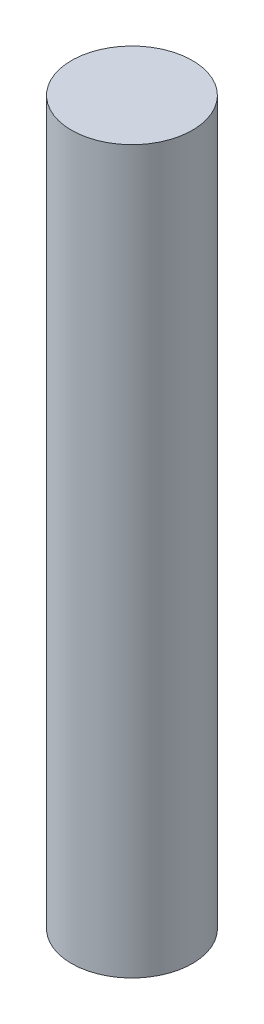
ISO-10303-21;
HEADER;
FILE_DESCRIPTION(('STEP AP214'),'2;1');
FILE_NAME('part.step','',(''),(''),'','','');
FILE_SCHEMA(('AUTOMOTIVE_DESIGN { 1 0 10303 214 1 1 1 1 }'));
ENDSEC;
DATA;
#1=APPLICATION_CONTEXT('core data for automotive mechanical design processes');
#2=APPLICATION_PROTOCOL_DEFINITION('international standard','automotive_design',2000,#1);
#3=PRODUCT_CONTEXT('',#1,'mechanical');
#4=PRODUCT('Part','Part','',(#3));
#5=PRODUCT_RELATED_PRODUCT_CATEGORY('part','',(#4));
#6=PRODUCT_DEFINITION_FORMATION('','',#4);
#7=PRODUCT_DEFINITION_CONTEXT('part definition',#1,'design');
#8=PRODUCT_DEFINITION('design','',#6,#7);
#9=PRODUCT_DEFINITION_SHAPE('','',#8);
#10=(LENGTH_UNIT() NAMED_UNIT(*) SI_UNIT(.MILLI.,.METRE.));
#11=(NAMED_UNIT(*) PLANE_ANGLE_UNIT() SI_UNIT($,.RADIAN.));
#12=(NAMED_UNIT(*) SI_UNIT($,.STERADIAN.) SOLID_ANGLE_UNIT());
#13=UNCERTAINTY_MEASURE_WITH_UNIT(LENGTH_MEASURE(1.E-05),#10,'distance_accuracy_value','');
#14=(GEOMETRIC_REPRESENTATION_CONTEXT(3) GLOBAL_UNCERTAINTY_ASSIGNED_CONTEXT((#13)) GLOBAL_UNIT_ASSIGNED_CONTEXT((#10,
#11,#12)) REPRESENTATION_CONTEXT('',''));
#15=CARTESIAN_POINT('',(0.,0.,0.));
#16=DIRECTION('',(0.,0.,1.));
#17=DIRECTION('',(1.,0.,0.));
#18=AXIS2_PLACEMENT_3D('',#15,#16,#17);
#19=CARTESIAN_POINT('',(0.,20.,0.));
#20=DIRECTION('',(0.,-1.,0.));
#21=DIRECTION('',(0.,0.,-1.));
#22=AXIS2_PLACEMENT_3D('',#19,#20,#21);
#23=CYLINDRICAL_SURFACE('',#22,1.675);
#24=CARTESIAN_POINT('',(0.,20.,0.));
#25=DIRECTION('',(0.,1.,0.));
#26=DIRECTION('',(0.,0.,1.));
#27=AXIS2_PLACEMENT_3D('',#24,#25,#26);
#28=CIRCLE('',#27,1.675);
#29=CARTESIAN_POINT('',(0.,20.,1.675));
#30=VERTEX_POINT('',#29);
#31=EDGE_CURVE('E10',#30,#30,#28,.T.);
#32=ORIENTED_EDGE('',*,*,#31,.F.);
#33=EDGE_LOOP('',(#32));
#34=FACE_BOUND('',#33,.T.);
#35=CARTESIAN_POINT('',(0.,0.,0.));
#36=DIRECTION('',(0.,1.,0.));
#37=DIRECTION('',(0.,0.,1.));
#38=AXIS2_PLACEMENT_3D('',#35,#36,#37);
#39=CIRCLE('',#38,1.675);
#40=CARTESIAN_POINT('',(0.,0.,1.675));
#41=VERTEX_POINT('',#40);
#42=EDGE_CURVE('E40',#41,#41,#39,.T.);
#43=ORIENTED_EDGE('',*,*,#42,.T.);
#44=EDGE_LOOP('',(#43));
#45=FACE_BOUND('',#44,.T.);
#46=ADVANCED_FACE('F37',(#34,#45),#23,.T.);
#47=CARTESIAN_POINT('',(0.,20.,0.));
#48=DIRECTION('',(0.,1.,0.));
#49=DIRECTION('',(0.,0.,1.));
#50=AXIS2_PLACEMENT_3D('',#47,#48,#49);
#51=PLANE('',#50);
#52=ORIENTED_EDGE('',*,*,#31,.T.);
#53=EDGE_LOOP('',(#52));
#54=FACE_BOUND('',#53,.T.);
#55=ADVANCED_FACE('F54',(#54),#51,.T.);
#56=CARTESIAN_POINT('',(0.,0.,0.));
#57=DIRECTION('',(0.,1.,0.));
#58=DIRECTION('',(0.,0.,1.));
#59=AXIS2_PLACEMENT_3D('',#56,#57,#58);
#60=PLANE('',#59);
#61=ORIENTED_EDGE('',*,*,#42,.F.);
#62=EDGE_LOOP('',(#61));
#63=FACE_BOUND('',#62,.T.);
#64=ADVANCED_FACE('F52',(#63),#60,.F.);
#65=CLOSED_SHELL('',(#46,#55,#64));
#66=MANIFOLD_SOLID_BREP('B2',#65);
#67=ADVANCED_BREP_SHAPE_REPRESENTATION('',(#18,#66),#14);
#68=SHAPE_DEFINITION_REPRESENTATION(#9,#67);
ENDSEC;
END-ISO-10303-21;
